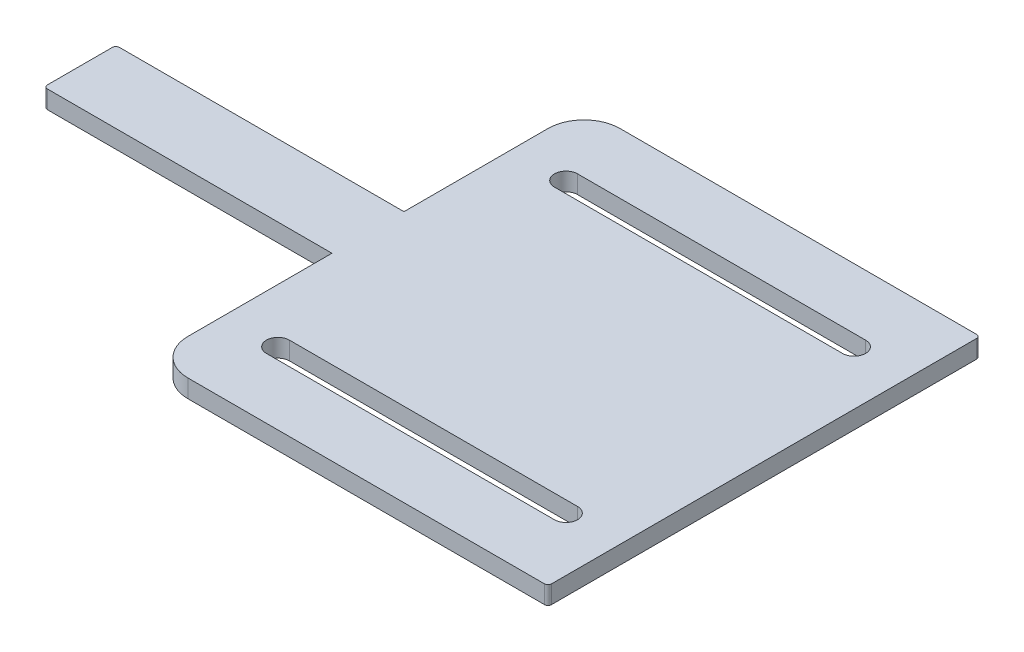
ISO-10303-21;
HEADER;
FILE_DESCRIPTION(('STEP AP214'),'2;1');
FILE_NAME('part.step','',(''),(''),'','','');
FILE_SCHEMA(('AUTOMOTIVE_DESIGN { 1 0 10303 214 1 1 1 1 }'));
ENDSEC;
DATA;
#1=APPLICATION_CONTEXT('core data for automotive mechanical design processes');
#2=APPLICATION_PROTOCOL_DEFINITION('international standard','automotive_design',2000,#1);
#3=PRODUCT_CONTEXT('',#1,'mechanical');
#4=PRODUCT('Part','Part','',(#3));
#5=PRODUCT_RELATED_PRODUCT_CATEGORY('part','',(#4));
#6=PRODUCT_DEFINITION_FORMATION('','',#4);
#7=PRODUCT_DEFINITION_CONTEXT('part definition',#1,'design');
#8=PRODUCT_DEFINITION('design','',#6,#7);
#9=PRODUCT_DEFINITION_SHAPE('','',#8);
#10=(LENGTH_UNIT() NAMED_UNIT(*) SI_UNIT(.MILLI.,.METRE.));
#11=(NAMED_UNIT(*) PLANE_ANGLE_UNIT() SI_UNIT($,.RADIAN.));
#12=(NAMED_UNIT(*) SI_UNIT($,.STERADIAN.) SOLID_ANGLE_UNIT());
#13=UNCERTAINTY_MEASURE_WITH_UNIT(LENGTH_MEASURE(1.E-05),#10,'distance_accuracy_value','');
#14=(GEOMETRIC_REPRESENTATION_CONTEXT(3) GLOBAL_UNCERTAINTY_ASSIGNED_CONTEXT((#13)) GLOBAL_UNIT_ASSIGNED_CONTEXT((#10,
#11,#12)) REPRESENTATION_CONTEXT('',''));
#15=CARTESIAN_POINT('',(0.,0.,0.));
#16=DIRECTION('',(0.,0.,1.));
#17=DIRECTION('',(1.,0.,0.));
#18=AXIS2_PLACEMENT_3D('',#15,#16,#17);
#19=CARTESIAN_POINT('',(-69.85,6.35,0.));
#20=DIRECTION('',(-1.,0.,0.));
#21=DIRECTION('',(0.,0.,1.));
#22=AXIS2_PLACEMENT_3D('',#19,#20,#21);
#23=PLANE('',#22);
#24=DIRECTION('',(0.,1.,0.));
#25=VECTOR('',#24,1.);
#26=CARTESIAN_POINT('',(-69.85,-104.726882890689,12.7));
#27=LINE('',#26,#25);
#28=CARTESIAN_POINT('',(-69.85,0.,12.7));
#29=VERTEX_POINT('',#28);
#30=CARTESIAN_POINT('',(-69.85,6.35,12.7));
#31=VERTEX_POINT('',#30);
#32=EDGE_CURVE('E209',#29,#31,#27,.T.);
#33=ORIENTED_EDGE('',*,*,#32,.F.);
#34=DIRECTION('',(0.,0.,-1.));
#35=VECTOR('',#34,1.);
#36=CARTESIAN_POINT('',(-69.85,0.,0.));
#37=LINE('',#36,#35);
#38=CARTESIAN_POINT('',(-69.85,0.,63.5));
#39=VERTEX_POINT('',#38);
#40=EDGE_CURVE('E377',#39,#29,#37,.T.);
#41=ORIENTED_EDGE('',*,*,#40,.F.);
#42=DIRECTION('',(0.,-1.,0.));
#43=VECTOR('',#42,1.);
#44=CARTESIAN_POINT('',(-69.85,6.35,63.5));
#45=LINE('',#44,#43);
#46=CARTESIAN_POINT('',(-69.85,6.35,63.5));
#47=VERTEX_POINT('',#46);
#48=EDGE_CURVE('E399',#39,#47,#45,.F.);
#49=ORIENTED_EDGE('',*,*,#48,.T.);
#50=DIRECTION('',(0.,0.,-1.));
#51=VECTOR('',#50,1.);
#52=CARTESIAN_POINT('',(-69.85,6.35,0.));
#53=LINE('',#52,#51);
#54=EDGE_CURVE('E219',#47,#31,#53,.T.);
#55=ORIENTED_EDGE('',*,*,#54,.T.);
#56=EDGE_LOOP('',(#33,#41,#49,#55));
#57=FACE_BOUND('',#56,.T.);
#58=ADVANCED_FACE('F40',(#57),#23,.T.);
#59=CARTESIAN_POINT('',(0.,6.35,46.736));
#60=DIRECTION('',(0.,0.,-1.));
#61=DIRECTION('',(-1.,0.,0.));
#62=AXIS2_PLACEMENT_3D('',#59,#60,#61);
#63=PLANE('',#62);
#64=DIRECTION('',(1.,0.,0.));
#65=VECTOR('',#64,1.);
#66=CARTESIAN_POINT('',(0.,0.,46.736));
#67=LINE('',#66,#65);
#68=CARTESIAN_POINT('',(-50.8000000000004,0.,46.736));
#69=VERTEX_POINT('',#68);
#70=CARTESIAN_POINT('',(50.7999999999996,0.,46.736));
#71=VERTEX_POINT('',#70);
#72=EDGE_CURVE('E416',#69,#71,#67,.T.);
#73=ORIENTED_EDGE('',*,*,#72,.T.);
#74=DIRECTION('',(0.,-1.,0.));
#75=VECTOR('',#74,1.);
#76=CARTESIAN_POINT('',(50.7999999999996,6.35,46.736));
#77=LINE('',#76,#75);
#78=CARTESIAN_POINT('',(50.7999999999996,6.35,46.736));
#79=VERTEX_POINT('',#78);
#80=EDGE_CURVE('E402',#79,#71,#77,.T.);
#81=ORIENTED_EDGE('',*,*,#80,.F.);
#82=DIRECTION('',(1.,0.,0.));
#83=VECTOR('',#82,1.);
#84=CARTESIAN_POINT('',(0.,6.35,46.736));
#85=LINE('',#84,#83);
#86=CARTESIAN_POINT('',(-50.8000000000004,6.35,46.736));
#87=VERTEX_POINT('',#86);
#88=EDGE_CURVE('E226',#87,#79,#85,.T.);
#89=ORIENTED_EDGE('',*,*,#88,.F.);
#90=DIRECTION('',(0.,-1.,0.));
#91=VECTOR('',#90,1.);
#92=CARTESIAN_POINT('',(-50.8000000000004,6.35,46.736));
#93=LINE('',#92,#91);
#94=EDGE_CURVE('E424',#87,#69,#93,.T.);
#95=ORIENTED_EDGE('',*,*,#94,.T.);
#96=EDGE_LOOP('',(#73,#81,#89,#95));
#97=FACE_BOUND('',#96,.T.);
#98=ADVANCED_FACE('F480',(#97),#63,.F.);
#99=CARTESIAN_POINT('',(50.7999999999996,6.35,50.8));
#100=DIRECTION('',(0.,-1.,0.));
#101=DIRECTION('',(0.,0.,-1.));
#102=AXIS2_PLACEMENT_3D('',#99,#100,#101);
#103=CYLINDRICAL_SURFACE('',#102,4.06400000000001);
#104=CARTESIAN_POINT('',(50.7999999999996,0.,50.8));
#105=DIRECTION('',(0.,1.,0.));
#106=DIRECTION('',(0.,0.,1.));
#107=AXIS2_PLACEMENT_3D('',#104,#105,#106);
#108=CIRCLE('',#107,4.06400000000001);
#109=CARTESIAN_POINT('',(50.7999999999996,0.,54.864));
#110=VERTEX_POINT('',#109);
#111=EDGE_CURVE('E419',#71,#110,#108,.F.);
#112=ORIENTED_EDGE('',*,*,#111,.T.);
#113=DIRECTION('',(0.,-1.,0.));
#114=VECTOR('',#113,1.);
#115=CARTESIAN_POINT('',(50.7999999999996,6.35,54.864));
#116=LINE('',#115,#114);
#117=CARTESIAN_POINT('',(50.7999999999996,6.35,54.864));
#118=VERTEX_POINT('',#117);
#119=EDGE_CURVE('E430',#118,#110,#116,.T.);
#120=ORIENTED_EDGE('',*,*,#119,.F.);
#121=CARTESIAN_POINT('',(50.7999999999996,6.35,50.8));
#122=DIRECTION('',(0.,1.,0.));
#123=DIRECTION('',(0.,0.,1.));
#124=AXIS2_PLACEMENT_3D('',#121,#122,#123);
#125=CIRCLE('',#124,4.06400000000001);
#126=EDGE_CURVE('E683',#79,#118,#125,.F.);
#127=ORIENTED_EDGE('',*,*,#126,.F.);
#128=ORIENTED_EDGE('',*,*,#80,.T.);
#129=EDGE_LOOP('',(#112,#120,#127,#128));
#130=FACE_BOUND('',#129,.T.);
#131=ADVANCED_FACE('F486',(#130),#103,.F.);
#132=CARTESIAN_POINT('',(0.,6.35,54.864));
#133=DIRECTION('',(0.,0.,-1.));
#134=DIRECTION('',(-1.,0.,0.));
#135=AXIS2_PLACEMENT_3D('',#132,#133,#134);
#136=PLANE('',#135);
#137=DIRECTION('',(1.,0.,0.));
#138=VECTOR('',#137,1.);
#139=CARTESIAN_POINT('',(0.,0.,54.864));
#140=LINE('',#139,#138);
#141=CARTESIAN_POINT('',(-50.8000000000004,0.,54.864));
#142=VERTEX_POINT('',#141);
#143=EDGE_CURVE('E355',#142,#110,#140,.T.);
#144=ORIENTED_EDGE('',*,*,#143,.F.);
#145=DIRECTION('',(0.,-1.,0.));
#146=VECTOR('',#145,1.);
#147=CARTESIAN_POINT('',(-50.8000000000004,6.35,54.864));
#148=LINE('',#147,#146);
#149=CARTESIAN_POINT('',(-50.8000000000004,6.35,54.864));
#150=VERTEX_POINT('',#149);
#151=EDGE_CURVE('E427',#150,#142,#148,.T.);
#152=ORIENTED_EDGE('',*,*,#151,.F.);
#153=DIRECTION('',(1.,0.,0.));
#154=VECTOR('',#153,1.);
#155=CARTESIAN_POINT('',(0.,6.35,54.864));
#156=LINE('',#155,#154);
#157=EDGE_CURVE('E681',#150,#118,#156,.T.);
#158=ORIENTED_EDGE('',*,*,#157,.T.);
#159=ORIENTED_EDGE('',*,*,#119,.T.);
#160=EDGE_LOOP('',(#144,#152,#158,#159));
#161=FACE_BOUND('',#160,.T.);
#162=ADVANCED_FACE('F599',(#161),#136,.T.);
#163=CARTESIAN_POINT('',(0.,6.35,76.2));
#164=DIRECTION('',(0.,0.,-1.));
#165=DIRECTION('',(-1.,0.,0.));
#166=AXIS2_PLACEMENT_3D('',#163,#164,#165);
#167=PLANE('',#166);
#168=DIRECTION('',(1.,0.,0.));
#169=VECTOR('',#168,1.);
#170=CARTESIAN_POINT('',(0.,0.,76.2));
#171=LINE('',#170,#169);
#172=CARTESIAN_POINT('',(-57.15,0.,76.2));
#173=VERTEX_POINT('',#172);
#174=CARTESIAN_POINT('',(68.58,0.,76.2));
#175=VERTEX_POINT('',#174);
#176=EDGE_CURVE('E331',#173,#175,#171,.T.);
#177=ORIENTED_EDGE('',*,*,#176,.T.);
#178=DIRECTION('',(0.,-1.,0.));
#179=VECTOR('',#178,1.);
#180=CARTESIAN_POINT('',(68.58,6.35,76.2));
#181=LINE('',#180,#179);
#182=CARTESIAN_POINT('',(68.58,6.35,76.2));
#183=VERTEX_POINT('',#182);
#184=EDGE_CURVE('E48',#175,#183,#181,.F.);
#185=ORIENTED_EDGE('',*,*,#184,.T.);
#186=DIRECTION('',(1.,0.,0.));
#187=VECTOR('',#186,1.);
#188=CARTESIAN_POINT('',(0.,6.35,76.2));
#189=LINE('',#188,#187);
#190=CARTESIAN_POINT('',(-57.15,6.35,76.2));
#191=VERTEX_POINT('',#190);
#192=EDGE_CURVE('E270',#191,#183,#189,.T.);
#193=ORIENTED_EDGE('',*,*,#192,.F.);
#194=DIRECTION('',(0.,-1.,0.));
#195=VECTOR('',#194,1.);
#196=CARTESIAN_POINT('',(-57.15,0.,76.2));
#197=LINE('',#196,#195);
#198=EDGE_CURVE('E249',#191,#173,#197,.T.);
#199=ORIENTED_EDGE('',*,*,#198,.T.);
#200=EDGE_LOOP('',(#177,#185,#193,#199));
#201=FACE_BOUND('',#200,.T.);
#202=ADVANCED_FACE('F329',(#201),#167,.F.);
#203=CARTESIAN_POINT('',(69.85,6.35,0.));
#204=DIRECTION('',(-1.,0.,0.));
#205=DIRECTION('',(0.,0.,1.));
#206=AXIS2_PLACEMENT_3D('',#203,#204,#205);
#207=PLANE('',#206);
#208=DIRECTION('',(0.,0.,-1.));
#209=VECTOR('',#208,1.);
#210=CARTESIAN_POINT('',(69.85,6.35,0.));
#211=LINE('',#210,#209);
#212=CARTESIAN_POINT('',(69.85,6.35,74.93));
#213=VERTEX_POINT('',#212);
#214=CARTESIAN_POINT('',(69.85,6.35,-74.93));
#215=VERTEX_POINT('',#214);
#216=EDGE_CURVE('E229',#213,#215,#211,.T.);
#217=ORIENTED_EDGE('',*,*,#216,.F.);
#218=DIRECTION('',(0.,-1.,0.));
#219=VECTOR('',#218,1.);
#220=CARTESIAN_POINT('',(69.85,6.35,74.93));
#221=LINE('',#220,#219);
#222=CARTESIAN_POINT('',(69.85,0.,74.93));
#223=VERTEX_POINT('',#222);
#224=EDGE_CURVE('E324',#213,#223,#221,.T.);
#225=ORIENTED_EDGE('',*,*,#224,.T.);
#226=DIRECTION('',(0.,0.,-1.));
#227=VECTOR('',#226,1.);
#228=CARTESIAN_POINT('',(69.85,0.,0.));
#229=LINE('',#228,#227);
#230=CARTESIAN_POINT('',(69.85,0.,-74.93));
#231=VERTEX_POINT('',#230);
#232=EDGE_CURVE('E411',#223,#231,#229,.T.);
#233=ORIENTED_EDGE('',*,*,#232,.T.);
#234=DIRECTION('',(0.,-1.,0.));
#235=VECTOR('',#234,1.);
#236=CARTESIAN_POINT('',(69.85,6.35,-74.93));
#237=LINE('',#236,#235);
#238=EDGE_CURVE('E322',#231,#215,#237,.F.);
#239=ORIENTED_EDGE('',*,*,#238,.T.);
#240=EDGE_LOOP('',(#217,#225,#233,#239));
#241=FACE_BOUND('',#240,.T.);
#242=ADVANCED_FACE('F582',(#241),#207,.F.);
#243=CARTESIAN_POINT('',(0.,6.35,-76.2));
#244=DIRECTION('',(0.,0.,-1.));
#245=DIRECTION('',(-1.,0.,0.));
#246=AXIS2_PLACEMENT_3D('',#243,#244,#245);
#247=PLANE('',#246);
#248=DIRECTION('',(1.,0.,0.));
#249=VECTOR('',#248,1.);
#250=CARTESIAN_POINT('',(0.,6.35,-76.2));
#251=LINE('',#250,#249);
#252=CARTESIAN_POINT('',(-57.15,6.35,-76.2));
#253=VERTEX_POINT('',#252);
#254=CARTESIAN_POINT('',(68.58,6.35,-76.2));
#255=VERTEX_POINT('',#254);
#256=EDGE_CURVE('E220',#253,#255,#251,.T.);
#257=ORIENTED_EDGE('',*,*,#256,.T.);
#258=DIRECTION('',(0.,-1.,0.));
#259=VECTOR('',#258,1.);
#260=CARTESIAN_POINT('',(68.58,0.,-76.2));
#261=LINE('',#260,#259);
#262=CARTESIAN_POINT('',(68.58,0.,-76.2));
#263=VERTEX_POINT('',#262);
#264=EDGE_CURVE('E12',#255,#263,#261,.T.);
#265=ORIENTED_EDGE('',*,*,#264,.T.);
#266=DIRECTION('',(1.,0.,0.));
#267=VECTOR('',#266,1.);
#268=CARTESIAN_POINT('',(0.,0.,-76.2));
#269=LINE('',#268,#267);
#270=CARTESIAN_POINT('',(-57.15,0.,-76.2));
#271=VERTEX_POINT('',#270);
#272=EDGE_CURVE('E391',#271,#263,#269,.T.);
#273=ORIENTED_EDGE('',*,*,#272,.F.);
#274=DIRECTION('',(0.,-1.,0.));
#275=VECTOR('',#274,1.);
#276=CARTESIAN_POINT('',(-57.15,6.35,-76.2));
#277=LINE('',#276,#275);
#278=EDGE_CURVE('E341',#271,#253,#277,.F.);
#279=ORIENTED_EDGE('',*,*,#278,.T.);
#280=EDGE_LOOP('',(#257,#265,#273,#279));
#281=FACE_BOUND('',#280,.T.);
#282=ADVANCED_FACE('F406',(#281),#247,.T.);
#283=CARTESIAN_POINT('',(-50.8000000000004,6.35,-50.8));
#284=DIRECTION('',(0.,-1.,0.));
#285=DIRECTION('',(0.,0.,-1.));
#286=AXIS2_PLACEMENT_3D('',#283,#284,#285);
#287=CYLINDRICAL_SURFACE('',#286,4.06400000000001);
#288=CARTESIAN_POINT('',(-50.8000000000004,0.,-50.8));
#289=DIRECTION('',(0.,1.,0.));
#290=DIRECTION('',(0.,0.,1.));
#291=AXIS2_PLACEMENT_3D('',#288,#289,#290);
#292=CIRCLE('',#291,4.06400000000001);
#293=CARTESIAN_POINT('',(-50.8000000000004,0.,-54.864));
#294=VERTEX_POINT('',#293);
#295=CARTESIAN_POINT('',(-50.8000000000004,0.,-46.736));
#296=VERTEX_POINT('',#295);
#297=EDGE_CURVE('E362',#294,#296,#292,.T.);
#298=ORIENTED_EDGE('',*,*,#297,.F.);
#299=DIRECTION('',(0.,-1.,0.));
#300=VECTOR('',#299,1.);
#301=CARTESIAN_POINT('',(-50.8000000000004,6.35,-54.864));
#302=LINE('',#301,#300);
#303=CARTESIAN_POINT('',(-50.8000000000004,6.35,-54.864));
#304=VERTEX_POINT('',#303);
#305=EDGE_CURVE('E428',#304,#294,#302,.T.);
#306=ORIENTED_EDGE('',*,*,#305,.F.);
#307=CARTESIAN_POINT('',(-50.8000000000004,6.35,-50.8));
#308=DIRECTION('',(0.,1.,0.));
#309=DIRECTION('',(0.,0.,1.));
#310=AXIS2_PLACEMENT_3D('',#307,#308,#309);
#311=CIRCLE('',#310,4.06400000000001);
#312=CARTESIAN_POINT('',(-50.8000000000004,6.35,-46.736));
#313=VERTEX_POINT('',#312);
#314=EDGE_CURVE('E348',#304,#313,#311,.T.);
#315=ORIENTED_EDGE('',*,*,#314,.T.);
#316=DIRECTION('',(0.,-1.,0.));
#317=VECTOR('',#316,1.);
#318=CARTESIAN_POINT('',(-50.8000000000004,6.35,-46.736));
#319=LINE('',#318,#317);
#320=EDGE_CURVE('E434',#313,#296,#319,.T.);
#321=ORIENTED_EDGE('',*,*,#320,.T.);
#322=EDGE_LOOP('',(#298,#306,#315,#321));
#323=FACE_BOUND('',#322,.T.);
#324=ADVANCED_FACE('F456',(#323),#287,.F.);
#325=CARTESIAN_POINT('',(0.,6.35,-54.864));
#326=DIRECTION('',(0.,0.,-1.));
#327=DIRECTION('',(-1.,0.,0.));
#328=AXIS2_PLACEMENT_3D('',#325,#326,#327);
#329=PLANE('',#328);
#330=DIRECTION('',(1.,0.,0.));
#331=VECTOR('',#330,1.);
#332=CARTESIAN_POINT('',(0.,0.,-54.864));
#333=LINE('',#332,#331);
#334=CARTESIAN_POINT('',(50.7999999999996,0.,-54.864));
#335=VERTEX_POINT('',#334);
#336=EDGE_CURVE('E446',#294,#335,#333,.T.);
#337=ORIENTED_EDGE('',*,*,#336,.T.);
#338=DIRECTION('',(0.,-1.,0.));
#339=VECTOR('',#338,1.);
#340=CARTESIAN_POINT('',(50.7999999999996,6.35,-54.864));
#341=LINE('',#340,#339);
#342=CARTESIAN_POINT('',(50.7999999999996,6.35,-54.864));
#343=VERTEX_POINT('',#342);
#344=EDGE_CURVE('E439',#343,#335,#341,.T.);
#345=ORIENTED_EDGE('',*,*,#344,.F.);
#346=DIRECTION('',(1.,0.,0.));
#347=VECTOR('',#346,1.);
#348=CARTESIAN_POINT('',(0.,6.35,-54.864));
#349=LINE('',#348,#347);
#350=EDGE_CURVE('E346',#304,#343,#349,.T.);
#351=ORIENTED_EDGE('',*,*,#350,.F.);
#352=ORIENTED_EDGE('',*,*,#305,.T.);
#353=EDGE_LOOP('',(#337,#345,#351,#352));
#354=FACE_BOUND('',#353,.T.);
#355=ADVANCED_FACE('F444',(#354),#329,.F.);
#356=CARTESIAN_POINT('',(50.7999999999996,6.35,-50.8));
#357=DIRECTION('',(0.,-1.,0.));
#358=DIRECTION('',(0.,0.,-1.));
#359=AXIS2_PLACEMENT_3D('',#356,#357,#358);
#360=CYLINDRICAL_SURFACE('',#359,4.06400000000001);
#361=CARTESIAN_POINT('',(50.7999999999996,0.,-50.8));
#362=DIRECTION('',(0.,1.,0.));
#363=DIRECTION('',(0.,0.,1.));
#364=AXIS2_PLACEMENT_3D('',#361,#362,#363);
#365=CIRCLE('',#364,4.06400000000001);
#366=CARTESIAN_POINT('',(50.7999999999996,0.,-46.736));
#367=VERTEX_POINT('',#366);
#368=EDGE_CURVE('E454',#367,#335,#365,.T.);
#369=ORIENTED_EDGE('',*,*,#368,.F.);
#370=DIRECTION('',(0.,-1.,0.));
#371=VECTOR('',#370,1.);
#372=CARTESIAN_POINT('',(50.7999999999996,6.35,-46.736));
#373=LINE('',#372,#371);
#374=CARTESIAN_POINT('',(50.7999999999996,6.35,-46.736));
#375=VERTEX_POINT('',#374);
#376=EDGE_CURVE('E436',#375,#367,#373,.T.);
#377=ORIENTED_EDGE('',*,*,#376,.F.);
#378=CARTESIAN_POINT('',(50.7999999999996,6.35,-50.8));
#379=DIRECTION('',(0.,1.,0.));
#380=DIRECTION('',(0.,0.,1.));
#381=AXIS2_PLACEMENT_3D('',#378,#379,#380);
#382=CIRCLE('',#381,4.06400000000001);
#383=EDGE_CURVE('E280',#375,#343,#382,.T.);
#384=ORIENTED_EDGE('',*,*,#383,.T.);
#385=ORIENTED_EDGE('',*,*,#344,.T.);
#386=EDGE_LOOP('',(#369,#377,#384,#385));
#387=FACE_BOUND('',#386,.T.);
#388=ADVANCED_FACE('F466',(#387),#360,.F.);
#389=DIRECTION('',(0.,1.,0.));
#390=VECTOR('',#389,1.);
#391=CARTESIAN_POINT('',(-69.85,-104.726882890689,-12.7));
#392=LINE('',#391,#390);
#393=CARTESIAN_POINT('',(-69.85,0.,-12.7));
#394=VERTEX_POINT('',#393);
#395=CARTESIAN_POINT('',(-69.85,6.35,-12.7));
#396=VERTEX_POINT('',#395);
#397=EDGE_CURVE('E194',#394,#396,#392,.T.);
#398=ORIENTED_EDGE('',*,*,#397,.T.);
#399=CARTESIAN_POINT('',(-69.85,6.35,-63.5));
#400=VERTEX_POINT('',#399);
#401=EDGE_CURVE('E206',#396,#400,#53,.T.);
#402=ORIENTED_EDGE('',*,*,#401,.T.);
#403=DIRECTION('',(0.,-1.,0.));
#404=VECTOR('',#403,1.);
#405=CARTESIAN_POINT('',(-69.85,6.35,-63.5));
#406=LINE('',#405,#404);
#407=CARTESIAN_POINT('',(-69.85,0.,-63.5));
#408=VERTEX_POINT('',#407);
#409=EDGE_CURVE('E396',#400,#408,#406,.T.);
#410=ORIENTED_EDGE('',*,*,#409,.T.);
#411=EDGE_CURVE('E208',#394,#408,#37,.T.);
#412=ORIENTED_EDGE('',*,*,#411,.F.);
#413=EDGE_LOOP('',(#398,#402,#410,#412));
#414=FACE_BOUND('',#413,.T.);
#415=ADVANCED_FACE('F204',(#414),#23,.T.);
#416=CARTESIAN_POINT('',(0.,6.35,-46.736));
#417=DIRECTION('',(0.,0.,-1.));
#418=DIRECTION('',(-1.,0.,0.));
#419=AXIS2_PLACEMENT_3D('',#416,#417,#418);
#420=PLANE('',#419);
#421=DIRECTION('',(1.,0.,0.));
#422=VECTOR('',#421,1.);
#423=CARTESIAN_POINT('',(0.,0.,-46.736));
#424=LINE('',#423,#422);
#425=EDGE_CURVE('E461',#296,#367,#424,.T.);
#426=ORIENTED_EDGE('',*,*,#425,.F.);
#427=ORIENTED_EDGE('',*,*,#320,.F.);
#428=DIRECTION('',(1.,0.,0.));
#429=VECTOR('',#428,1.);
#430=CARTESIAN_POINT('',(0.,6.35,-46.736));
#431=LINE('',#430,#429);
#432=EDGE_CURVE('E275',#313,#375,#431,.T.);
#433=ORIENTED_EDGE('',*,*,#432,.T.);
#434=ORIENTED_EDGE('',*,*,#376,.T.);
#435=EDGE_LOOP('',(#426,#427,#433,#434));
#436=FACE_BOUND('',#435,.T.);
#437=ADVANCED_FACE('F463',(#436),#420,.T.);
#438=CARTESIAN_POINT('',(-50.8000000000004,6.35,50.8));
#439=DIRECTION('',(0.,-1.,0.));
#440=DIRECTION('',(0.,0.,-1.));
#441=AXIS2_PLACEMENT_3D('',#438,#439,#440);
#442=CYLINDRICAL_SURFACE('',#441,4.06400000000001);
#443=CARTESIAN_POINT('',(-50.8000000000004,0.,50.8));
#444=DIRECTION('',(0.,1.,0.));
#445=DIRECTION('',(0.,0.,1.));
#446=AXIS2_PLACEMENT_3D('',#443,#444,#445);
#447=CIRCLE('',#446,4.06400000000001);
#448=EDGE_CURVE('E350',#142,#69,#447,.F.);
#449=ORIENTED_EDGE('',*,*,#448,.T.);
#450=ORIENTED_EDGE('',*,*,#94,.F.);
#451=CARTESIAN_POINT('',(-50.8000000000004,6.35,50.8));
#452=DIRECTION('',(0.,1.,0.));
#453=DIRECTION('',(0.,0.,1.));
#454=AXIS2_PLACEMENT_3D('',#451,#452,#453);
#455=CIRCLE('',#454,4.06400000000001);
#456=EDGE_CURVE('E437',#150,#87,#455,.F.);
#457=ORIENTED_EDGE('',*,*,#456,.F.);
#458=ORIENTED_EDGE('',*,*,#151,.T.);
#459=EDGE_LOOP('',(#449,#450,#457,#458));
#460=FACE_BOUND('',#459,.T.);
#461=ADVANCED_FACE('F469',(#460),#442,.F.);
#462=CARTESIAN_POINT('',(0.,6.35,0.));
#463=DIRECTION('',(0.,1.,0.));
#464=DIRECTION('',(0.,0.,1.));
#465=AXIS2_PLACEMENT_3D('',#462,#463,#464);
#466=PLANE('',#465);
#467=ORIENTED_EDGE('',*,*,#314,.F.);
#468=ORIENTED_EDGE('',*,*,#350,.T.);
#469=ORIENTED_EDGE('',*,*,#383,.F.);
#470=ORIENTED_EDGE('',*,*,#432,.F.);
#471=EDGE_LOOP('',(#467,#468,#469,#470));
#472=FACE_BOUND('',#471,.T.);
#473=DIRECTION('',(-1.,0.,0.));
#474=VECTOR('',#473,1.);
#475=CARTESIAN_POINT('',(-171.45,6.35,-12.7));
#476=LINE('',#475,#474);
#477=CARTESIAN_POINT('',(-170.18,6.35,-12.7));
#478=VERTEX_POINT('',#477);
#479=EDGE_CURVE('E190',#396,#478,#476,.T.);
#480=ORIENTED_EDGE('',*,*,#479,.T.);
#481=CARTESIAN_POINT('',(-170.18,6.34999999999999,-11.43));
#482=DIRECTION('',(0.,1.,0.));
#483=DIRECTION('',(0.,0.,1.));
#484=AXIS2_PLACEMENT_3D('',#481,#482,#483);
#485=CIRCLE('',#484,1.27);
#486=CARTESIAN_POINT('',(-171.45,6.35,-11.43));
#487=VERTEX_POINT('',#486);
#488=EDGE_CURVE('E305',#478,#487,#485,.T.);
#489=ORIENTED_EDGE('',*,*,#488,.T.);
#490=DIRECTION('',(0.,0.,1.));
#491=VECTOR('',#490,1.);
#492=CARTESIAN_POINT('',(-171.45,6.35,-12.7));
#493=LINE('',#492,#491);
#494=CARTESIAN_POINT('',(-171.45,6.35,11.43));
#495=VERTEX_POINT('',#494);
#496=EDGE_CURVE('E201',#487,#495,#493,.T.);
#497=ORIENTED_EDGE('',*,*,#496,.T.);
#498=CARTESIAN_POINT('',(-170.18,6.34999999999999,11.43));
#499=DIRECTION('',(0.,1.,0.));
#500=DIRECTION('',(0.,0.,1.));
#501=AXIS2_PLACEMENT_3D('',#498,#499,#500);
#502=CIRCLE('',#501,1.27);
#503=CARTESIAN_POINT('',(-170.18,6.35,12.7));
#504=VERTEX_POINT('',#503);
#505=EDGE_CURVE('E302',#495,#504,#502,.T.);
#506=ORIENTED_EDGE('',*,*,#505,.T.);
#507=DIRECTION('',(1.,0.,0.));
#508=VECTOR('',#507,1.);
#509=CARTESIAN_POINT('',(-171.45,6.35,12.7));
#510=LINE('',#509,#508);
#511=EDGE_CURVE('E210',#504,#31,#510,.T.);
#512=ORIENTED_EDGE('',*,*,#511,.T.);
#513=ORIENTED_EDGE('',*,*,#54,.F.);
#514=CARTESIAN_POINT('',(-57.15,6.35,63.5));
#515=DIRECTION('',(0.,1.,0.));
#516=DIRECTION('',(0.,0.,1.));
#517=AXIS2_PLACEMENT_3D('',#514,#515,#516);
#518=CIRCLE('',#517,12.7);
#519=EDGE_CURVE('E250',#47,#191,#518,.T.);
#520=ORIENTED_EDGE('',*,*,#519,.T.);
#521=ORIENTED_EDGE('',*,*,#192,.T.);
#522=CARTESIAN_POINT('',(68.58,6.35,74.93));
#523=DIRECTION('',(0.,1.,0.));
#524=DIRECTION('',(0.,0.,1.));
#525=AXIS2_PLACEMENT_3D('',#522,#523,#524);
#526=CIRCLE('',#525,1.27);
#527=EDGE_CURVE('E260',#183,#213,#526,.T.);
#528=ORIENTED_EDGE('',*,*,#527,.T.);
#529=ORIENTED_EDGE('',*,*,#216,.T.);
#530=CARTESIAN_POINT('',(68.58,6.35,-74.93));
#531=DIRECTION('',(0.,1.,0.));
#532=DIRECTION('',(0.,0.,1.));
#533=AXIS2_PLACEMENT_3D('',#530,#531,#532);
#534=CIRCLE('',#533,1.27);
#535=EDGE_CURVE('E256',#215,#255,#534,.T.);
#536=ORIENTED_EDGE('',*,*,#535,.T.);
#537=ORIENTED_EDGE('',*,*,#256,.F.);
#538=CARTESIAN_POINT('',(-57.15,6.35,-63.5));
#539=DIRECTION('',(0.,1.,0.));
#540=DIRECTION('',(0.,0.,1.));
#541=AXIS2_PLACEMENT_3D('',#538,#539,#540);
#542=CIRCLE('',#541,12.7);
#543=EDGE_CURVE('E216',#253,#400,#542,.T.);
#544=ORIENTED_EDGE('',*,*,#543,.T.);
#545=ORIENTED_EDGE('',*,*,#401,.F.);
#546=EDGE_LOOP('',(#480,#489,#497,#506,#512,#513,#520,#521,#528,#529,#536,#537,#544,#545));
#547=FACE_BOUND('',#546,.T.);
#548=ORIENTED_EDGE('',*,*,#88,.T.);
#549=ORIENTED_EDGE('',*,*,#126,.T.);
#550=ORIENTED_EDGE('',*,*,#157,.F.);
#551=ORIENTED_EDGE('',*,*,#456,.T.);
#552=EDGE_LOOP('',(#548,#549,#550,#551));
#553=FACE_BOUND('',#552,.T.);
#554=ADVANCED_FACE('F212',(#472,#547,#553),#466,.T.);
#555=CARTESIAN_POINT('',(0.,0.,0.));
#556=DIRECTION('',(0.,1.,0.));
#557=DIRECTION('',(0.,0.,1.));
#558=AXIS2_PLACEMENT_3D('',#555,#556,#557);
#559=PLANE('',#558);
#560=ORIENTED_EDGE('',*,*,#297,.T.);
#561=ORIENTED_EDGE('',*,*,#425,.T.);
#562=ORIENTED_EDGE('',*,*,#368,.T.);
#563=ORIENTED_EDGE('',*,*,#336,.F.);
#564=EDGE_LOOP('',(#560,#561,#562,#563));
#565=FACE_BOUND('',#564,.T.);
#566=DIRECTION('',(0.,0.,-1.));
#567=VECTOR('',#566,1.);
#568=CARTESIAN_POINT('',(-171.45,0.,-12.7));
#569=LINE('',#568,#567);
#570=CARTESIAN_POINT('',(-171.45,0.,11.43));
#571=VERTEX_POINT('',#570);
#572=CARTESIAN_POINT('',(-171.45,0.,-11.43));
#573=VERTEX_POINT('',#572);
#574=EDGE_CURVE('E364',#571,#573,#569,.T.);
#575=ORIENTED_EDGE('',*,*,#574,.T.);
#576=CARTESIAN_POINT('',(-170.18,0.,-11.43));
#577=DIRECTION('',(0.,1.,0.));
#578=DIRECTION('',(0.,0.,1.));
#579=AXIS2_PLACEMENT_3D('',#576,#577,#578);
#580=CIRCLE('',#579,1.27);
#581=CARTESIAN_POINT('',(-170.18,0.,-12.7));
#582=VERTEX_POINT('',#581);
#583=EDGE_CURVE('E318',#573,#582,#580,.F.);
#584=ORIENTED_EDGE('',*,*,#583,.T.);
#585=DIRECTION('',(1.,0.,0.));
#586=VECTOR('',#585,1.);
#587=CARTESIAN_POINT('',(-171.45,0.,-12.7));
#588=LINE('',#587,#586);
#589=EDGE_CURVE('E359',#582,#394,#588,.T.);
#590=ORIENTED_EDGE('',*,*,#589,.T.);
#591=ORIENTED_EDGE('',*,*,#411,.T.);
#592=CARTESIAN_POINT('',(-57.15,0.,-63.5));
#593=DIRECTION('',(0.,1.,0.));
#594=DIRECTION('',(0.,0.,1.));
#595=AXIS2_PLACEMENT_3D('',#592,#593,#594);
#596=CIRCLE('',#595,12.7);
#597=EDGE_CURVE('E389',#408,#271,#596,.F.);
#598=ORIENTED_EDGE('',*,*,#597,.T.);
#599=ORIENTED_EDGE('',*,*,#272,.T.);
#600=CARTESIAN_POINT('',(68.58,0.,-74.93));
#601=DIRECTION('',(0.,1.,0.));
#602=DIRECTION('',(0.,0.,1.));
#603=AXIS2_PLACEMENT_3D('',#600,#601,#602);
#604=CIRCLE('',#603,1.27);
#605=EDGE_CURVE('E61',#263,#231,#604,.F.);
#606=ORIENTED_EDGE('',*,*,#605,.T.);
#607=ORIENTED_EDGE('',*,*,#232,.F.);
#608=CARTESIAN_POINT('',(68.58,0.,74.93));
#609=DIRECTION('',(0.,1.,0.));
#610=DIRECTION('',(0.,0.,1.));
#611=AXIS2_PLACEMENT_3D('',#608,#609,#610);
#612=CIRCLE('',#611,1.27);
#613=EDGE_CURVE('E55',#223,#175,#612,.F.);
#614=ORIENTED_EDGE('',*,*,#613,.T.);
#615=ORIENTED_EDGE('',*,*,#176,.F.);
#616=CARTESIAN_POINT('',(-57.15,0.,63.5));
#617=DIRECTION('',(0.,1.,0.));
#618=DIRECTION('',(0.,0.,1.));
#619=AXIS2_PLACEMENT_3D('',#616,#617,#618);
#620=CIRCLE('',#619,12.7);
#621=EDGE_CURVE('E397',#173,#39,#620,.F.);
#622=ORIENTED_EDGE('',*,*,#621,.T.);
#623=ORIENTED_EDGE('',*,*,#40,.T.);
#624=DIRECTION('',(-1.,0.,0.));
#625=VECTOR('',#624,1.);
#626=CARTESIAN_POINT('',(-171.45,0.,12.7));
#627=LINE('',#626,#625);
#628=CARTESIAN_POINT('',(-170.18,0.,12.7));
#629=VERTEX_POINT('',#628);
#630=EDGE_CURVE('E293',#29,#629,#627,.T.);
#631=ORIENTED_EDGE('',*,*,#630,.T.);
#632=CARTESIAN_POINT('',(-170.18,0.,11.43));
#633=DIRECTION('',(0.,1.,0.));
#634=DIRECTION('',(0.,0.,1.));
#635=AXIS2_PLACEMENT_3D('',#632,#633,#634);
#636=CIRCLE('',#635,1.27);
#637=EDGE_CURVE('E316',#629,#571,#636,.F.);
#638=ORIENTED_EDGE('',*,*,#637,.T.);
#639=EDGE_LOOP('',(#575,#584,#590,#591,#598,#599,#606,#607,#614,#615,#622,#623,#631,#638));
#640=FACE_BOUND('',#639,.T.);
#641=ORIENTED_EDGE('',*,*,#72,.F.);
#642=ORIENTED_EDGE('',*,*,#448,.F.);
#643=ORIENTED_EDGE('',*,*,#143,.T.);
#644=ORIENTED_EDGE('',*,*,#111,.F.);
#645=EDGE_LOOP('',(#641,#642,#643,#644));
#646=FACE_BOUND('',#645,.T.);
#647=ADVANCED_FACE('F374',(#565,#640,#646),#559,.F.);
#648=CARTESIAN_POINT('',(-57.15,6.35,-63.5));
#649=DIRECTION('',(0.,-1.,0.));
#650=DIRECTION('',(0.,0.,-1.));
#651=AXIS2_PLACEMENT_3D('',#648,#649,#650);
#652=CYLINDRICAL_SURFACE('',#651,12.7);
#653=ORIENTED_EDGE('',*,*,#543,.F.);
#654=ORIENTED_EDGE('',*,*,#278,.F.);
#655=ORIENTED_EDGE('',*,*,#597,.F.);
#656=ORIENTED_EDGE('',*,*,#409,.F.);
#657=EDGE_LOOP('',(#653,#654,#655,#656));
#658=FACE_BOUND('',#657,.T.);
#659=ADVANCED_FACE('F395',(#658),#652,.T.);
#660=CARTESIAN_POINT('',(-57.15,6.35,63.5));
#661=DIRECTION('',(0.,1.,0.));
#662=DIRECTION('',(0.,0.,1.));
#663=AXIS2_PLACEMENT_3D('',#660,#661,#662);
#664=CYLINDRICAL_SURFACE('',#663,12.7);
#665=ORIENTED_EDGE('',*,*,#519,.F.);
#666=ORIENTED_EDGE('',*,*,#48,.F.);
#667=ORIENTED_EDGE('',*,*,#621,.F.);
#668=ORIENTED_EDGE('',*,*,#198,.F.);
#669=EDGE_LOOP('',(#665,#666,#667,#668));
#670=FACE_BOUND('',#669,.T.);
#671=ADVANCED_FACE('F507',(#670),#664,.T.);
#672=CARTESIAN_POINT('',(-171.45,-104.726882890689,12.7));
#673=DIRECTION('',(0.,0.,1.));
#674=DIRECTION('',(1.,0.,0.));
#675=AXIS2_PLACEMENT_3D('',#672,#673,#674);
#676=PLANE('',#675);
#677=ORIENTED_EDGE('',*,*,#511,.F.);
#678=DIRECTION('',(0.,1.,0.));
#679=VECTOR('',#678,1.);
#680=CARTESIAN_POINT('',(-170.18,-104.726882890689,12.7));
#681=LINE('',#680,#679);
#682=EDGE_CURVE('E320',#504,#629,#681,.F.);
#683=ORIENTED_EDGE('',*,*,#682,.T.);
#684=ORIENTED_EDGE('',*,*,#630,.F.);
#685=ORIENTED_EDGE('',*,*,#32,.T.);
#686=EDGE_LOOP('',(#677,#683,#684,#685));
#687=FACE_BOUND('',#686,.T.);
#688=ADVANCED_FACE('F510',(#687),#676,.T.);
#689=CARTESIAN_POINT('',(-171.45,-104.726882890689,-12.7));
#690=DIRECTION('',(-1.,0.,0.));
#691=DIRECTION('',(0.,0.,1.));
#692=AXIS2_PLACEMENT_3D('',#689,#690,#691);
#693=PLANE('',#692);
#694=ORIENTED_EDGE('',*,*,#496,.F.);
#695=DIRECTION('',(0.,1.,0.));
#696=VECTOR('',#695,1.);
#697=CARTESIAN_POINT('',(-171.45,-104.726882890689,-11.43));
#698=LINE('',#697,#696);
#699=EDGE_CURVE('E312',#487,#573,#698,.F.);
#700=ORIENTED_EDGE('',*,*,#699,.T.);
#701=ORIENTED_EDGE('',*,*,#574,.F.);
#702=DIRECTION('',(0.,1.,0.));
#703=VECTOR('',#702,1.);
#704=CARTESIAN_POINT('',(-171.45,-104.726882890689,11.43));
#705=LINE('',#704,#703);
#706=EDGE_CURVE('E309',#571,#495,#705,.T.);
#707=ORIENTED_EDGE('',*,*,#706,.T.);
#708=EDGE_LOOP('',(#694,#700,#701,#707));
#709=FACE_BOUND('',#708,.T.);
#710=ADVANCED_FACE('F384',(#709),#693,.T.);
#711=CARTESIAN_POINT('',(-171.45,-104.726882890689,-12.7));
#712=DIRECTION('',(0.,0.,-1.));
#713=DIRECTION('',(-1.,0.,0.));
#714=AXIS2_PLACEMENT_3D('',#711,#712,#713);
#715=PLANE('',#714);
#716=ORIENTED_EDGE('',*,*,#589,.F.);
#717=DIRECTION('',(0.,1.,0.));
#718=VECTOR('',#717,1.);
#719=CARTESIAN_POINT('',(-170.18,-104.726882890689,-12.7));
#720=LINE('',#719,#718);
#721=EDGE_CURVE('E197',#582,#478,#720,.T.);
#722=ORIENTED_EDGE('',*,*,#721,.T.);
#723=ORIENTED_EDGE('',*,*,#479,.F.);
#724=ORIENTED_EDGE('',*,*,#397,.F.);
#725=EDGE_LOOP('',(#716,#722,#723,#724));
#726=FACE_BOUND('',#725,.T.);
#727=ADVANCED_FACE('F193',(#726),#715,.T.);
#728=CARTESIAN_POINT('',(-170.18,-104.726882890689,-11.43));
#729=DIRECTION('',(0.,1.,0.));
#730=DIRECTION('',(0.,0.,1.));
#731=AXIS2_PLACEMENT_3D('',#728,#729,#730);
#732=CYLINDRICAL_SURFACE('',#731,1.27);
#733=ORIENTED_EDGE('',*,*,#583,.F.);
#734=ORIENTED_EDGE('',*,*,#699,.F.);
#735=ORIENTED_EDGE('',*,*,#488,.F.);
#736=ORIENTED_EDGE('',*,*,#721,.F.);
#737=EDGE_LOOP('',(#733,#734,#735,#736));
#738=FACE_BOUND('',#737,.T.);
#739=ADVANCED_FACE('F387',(#738),#732,.T.);
#740=CARTESIAN_POINT('',(-170.18,-104.726882890689,11.43));
#741=DIRECTION('',(0.,1.,0.));
#742=DIRECTION('',(0.,0.,1.));
#743=AXIS2_PLACEMENT_3D('',#740,#741,#742);
#744=CYLINDRICAL_SURFACE('',#743,1.27);
#745=ORIENTED_EDGE('',*,*,#637,.F.);
#746=ORIENTED_EDGE('',*,*,#682,.F.);
#747=ORIENTED_EDGE('',*,*,#505,.F.);
#748=ORIENTED_EDGE('',*,*,#706,.F.);
#749=EDGE_LOOP('',(#745,#746,#747,#748));
#750=FACE_BOUND('',#749,.T.);
#751=ADVANCED_FACE('F381',(#750),#744,.T.);
#752=CARTESIAN_POINT('',(68.58,6.35,74.93));
#753=DIRECTION('',(0.,-1.,0.));
#754=DIRECTION('',(0.,0.,-1.));
#755=AXIS2_PLACEMENT_3D('',#752,#753,#754);
#756=CYLINDRICAL_SURFACE('',#755,1.27);
#757=ORIENTED_EDGE('',*,*,#527,.F.);
#758=ORIENTED_EDGE('',*,*,#184,.F.);
#759=ORIENTED_EDGE('',*,*,#613,.F.);
#760=ORIENTED_EDGE('',*,*,#224,.F.);
#761=EDGE_LOOP('',(#757,#758,#759,#760));
#762=FACE_BOUND('',#761,.T.);
#763=ADVANCED_FACE('F338',(#762),#756,.T.);
#764=CARTESIAN_POINT('',(68.58,6.35,-74.93));
#765=DIRECTION('',(0.,1.,0.));
#766=DIRECTION('',(0.,0.,1.));
#767=AXIS2_PLACEMENT_3D('',#764,#765,#766);
#768=CYLINDRICAL_SURFACE('',#767,1.27);
#769=ORIENTED_EDGE('',*,*,#535,.F.);
#770=ORIENTED_EDGE('',*,*,#238,.F.);
#771=ORIENTED_EDGE('',*,*,#605,.F.);
#772=ORIENTED_EDGE('',*,*,#264,.F.);
#773=EDGE_LOOP('',(#769,#770,#771,#772));
#774=FACE_BOUND('',#773,.T.);
#775=ADVANCED_FACE('F42',(#774),#768,.T.);
#776=CLOSED_SHELL('',(#58,#98,#131,#162,#202,#242,#282,#324,#355,#388,#415,#437,#461,#554,#647,
#659,#671,#688,#710,#727,#739,#751,#763,#775));
#777=MANIFOLD_SOLID_BREP('B2',#776);
#778=ADVANCED_BREP_SHAPE_REPRESENTATION('',(#18,#777),#14);
#779=SHAPE_DEFINITION_REPRESENTATION(#9,#778);
ENDSEC;
END-ISO-10303-21;
